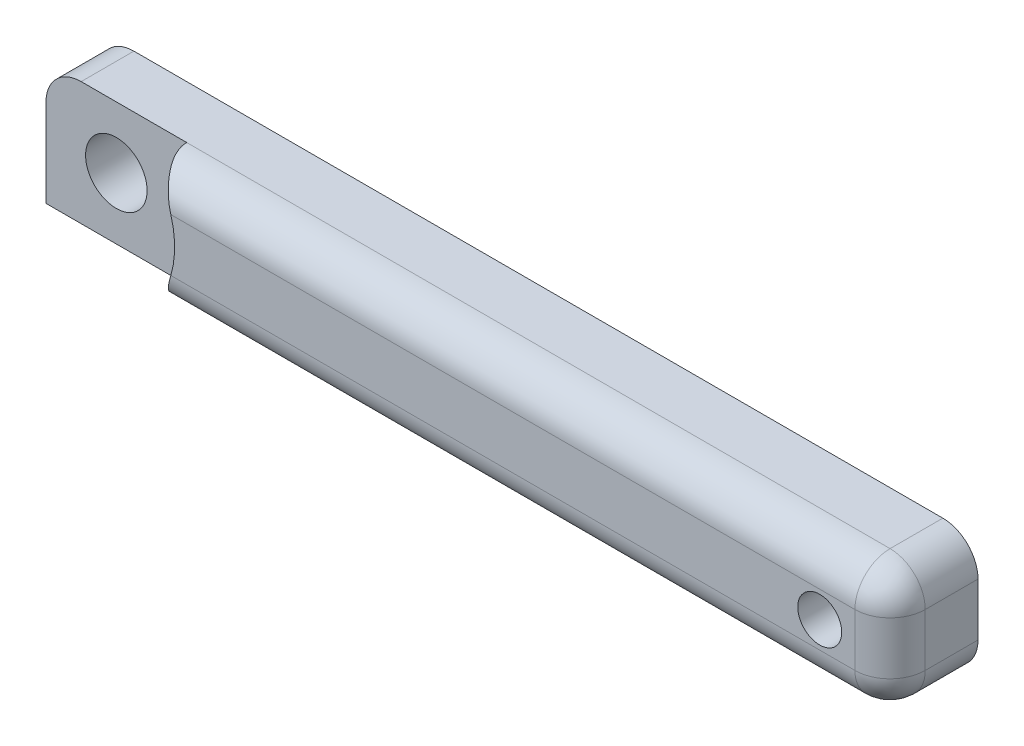
ISO-10303-21;
HEADER;
FILE_DESCRIPTION(('STEP AP214'),'2;1');
FILE_NAME('part.step','',(''),(''),'','','');
FILE_SCHEMA(('AUTOMOTIVE_DESIGN { 1 0 10303 214 1 1 1 1 }'));
ENDSEC;
DATA;
#1=APPLICATION_CONTEXT('core data for automotive mechanical design processes');
#2=APPLICATION_PROTOCOL_DEFINITION('international standard','automotive_design',2000,#1);
#3=PRODUCT_CONTEXT('',#1,'mechanical');
#4=PRODUCT('Part','Part','',(#3));
#5=PRODUCT_RELATED_PRODUCT_CATEGORY('part','',(#4));
#6=PRODUCT_DEFINITION_FORMATION('','',#4);
#7=PRODUCT_DEFINITION_CONTEXT('part definition',#1,'design');
#8=PRODUCT_DEFINITION('design','',#6,#7);
#9=PRODUCT_DEFINITION_SHAPE('','',#8);
#10=(LENGTH_UNIT() NAMED_UNIT(*) SI_UNIT(.MILLI.,.METRE.));
#11=(NAMED_UNIT(*) PLANE_ANGLE_UNIT() SI_UNIT($,.RADIAN.));
#12=(NAMED_UNIT(*) SI_UNIT($,.STERADIAN.) SOLID_ANGLE_UNIT());
#13=UNCERTAINTY_MEASURE_WITH_UNIT(LENGTH_MEASURE(1.E-05),#10,'distance_accuracy_value','');
#14=(GEOMETRIC_REPRESENTATION_CONTEXT(3) GLOBAL_UNCERTAINTY_ASSIGNED_CONTEXT((#13)) GLOBAL_UNIT_ASSIGNED_CONTEXT((#10,
#11,#12)) REPRESENTATION_CONTEXT('',''));
#15=CARTESIAN_POINT('',(0.,0.,0.));
#16=DIRECTION('',(0.,0.,1.));
#17=DIRECTION('',(1.,0.,0.));
#18=AXIS2_PLACEMENT_3D('',#15,#16,#17);
#19=CARTESIAN_POINT('',(4.,3.5,0.));
#20=DIRECTION('',(0.,0.,1.));
#21=DIRECTION('',(1.,0.,0.));
#22=AXIS2_PLACEMENT_3D('',#19,#20,#21);
#23=CYLINDRICAL_SURFACE('',#22,1.75);
#24=CARTESIAN_POINT('',(4.,3.5,0.));
#25=DIRECTION('',(0.,0.,1.));
#26=DIRECTION('',(1.,0.,0.));
#27=AXIS2_PLACEMENT_3D('',#24,#25,#26);
#28=CIRCLE('',#27,1.75);
#29=CARTESIAN_POINT('',(5.75,3.5,0.));
#30=VERTEX_POINT('',#29);
#31=EDGE_CURVE('E137',#30,#30,#28,.T.);
#32=ORIENTED_EDGE('',*,*,#31,.F.);
#33=EDGE_LOOP('',(#32));
#34=FACE_BOUND('',#33,.T.);
#35=CARTESIAN_POINT('',(4.,3.5,3.));
#36=DIRECTION('',(0.,0.,1.));
#37=DIRECTION('',(1.,0.,0.));
#38=AXIS2_PLACEMENT_3D('',#35,#36,#37);
#39=CIRCLE('',#38,1.75);
#40=CARTESIAN_POINT('',(5.75,3.5,3.));
#41=VERTEX_POINT('',#40);
#42=EDGE_CURVE('E179',#41,#41,#39,.F.);
#43=ORIENTED_EDGE('',*,*,#42,.F.);
#44=EDGE_LOOP('',(#43));
#45=FACE_BOUND('',#44,.T.);
#46=ADVANCED_FACE('F37',(#34,#45),#23,.F.);
#47=CARTESIAN_POINT('',(0.,4.99999999999999,5.));
#48=DIRECTION('',(1.,0.,0.));
#49=DIRECTION('',(0.,0.,-1.));
#50=AXIS2_PLACEMENT_3D('',#47,#48,#49);
#51=PLANE('',#50);
#52=DIRECTION('',(0.,0.,-1.));
#53=VECTOR('',#52,1.);
#54=CARTESIAN_POINT('',(0.,0.,5.));
#55=LINE('',#54,#53);
#56=CARTESIAN_POINT('',(0.,0.,3.));
#57=VERTEX_POINT('',#56);
#58=CARTESIAN_POINT('',(0.,0.,0.));
#59=VERTEX_POINT('',#58);
#60=EDGE_CURVE('E144',#57,#59,#55,.T.);
#61=ORIENTED_EDGE('',*,*,#60,.F.);
#62=DIRECTION('',(0.,-1.,0.));
#63=VECTOR('',#62,1.);
#64=CARTESIAN_POINT('',(0.,4.99999999999999,3.));
#65=LINE('',#64,#63);
#66=CARTESIAN_POINT('',(0.,5.,3.));
#67=VERTEX_POINT('',#66);
#68=EDGE_CURVE('E52',#57,#67,#65,.F.);
#69=ORIENTED_EDGE('',*,*,#68,.T.);
#70=DIRECTION('',(0.,0.,-1.));
#71=VECTOR('',#70,1.);
#72=CARTESIAN_POINT('',(0.,4.99999999999999,5.));
#73=LINE('',#72,#71);
#74=CARTESIAN_POINT('',(0.,4.99999999999999,0.));
#75=VERTEX_POINT('',#74);
#76=EDGE_CURVE('E283',#67,#75,#73,.T.);
#77=ORIENTED_EDGE('',*,*,#76,.T.);
#78=DIRECTION('',(0.,-1.,0.));
#79=VECTOR('',#78,1.);
#80=CARTESIAN_POINT('',(0.,4.99999999999999,0.));
#81=LINE('',#80,#79);
#82=EDGE_CURVE('E300',#75,#59,#81,.T.);
#83=ORIENTED_EDGE('',*,*,#82,.T.);
#84=EDGE_LOOP('',(#61,#69,#77,#83));
#85=FACE_BOUND('',#84,.T.);
#86=ADVANCED_FACE('F201',(#85),#51,.F.);
#87=CARTESIAN_POINT('',(0.,0.,5.));
#88=DIRECTION('',(0.,1.,0.));
#89=DIRECTION('',(0.,0.,1.));
#90=AXIS2_PLACEMENT_3D('',#87,#88,#89);
#91=PLANE('',#90);
#92=DIRECTION('',(0.,0.,-1.));
#93=VECTOR('',#92,1.);
#94=CARTESIAN_POINT('',(48.,0.,5.));
#95=LINE('',#94,#93);
#96=CARTESIAN_POINT('',(48.,0.,3.));
#97=VERTEX_POINT('',#96);
#98=CARTESIAN_POINT('',(48.,0.,0.));
#99=VERTEX_POINT('',#98);
#100=EDGE_CURVE('E148',#97,#99,#95,.T.);
#101=ORIENTED_EDGE('',*,*,#100,.F.);
#102=DIRECTION('',(1.,0.,0.));
#103=VECTOR('',#102,1.);
#104=CARTESIAN_POINT('',(0.,0.,3.));
#105=LINE('',#104,#103);
#106=CARTESIAN_POINT('',(8.,0.,3.));
#107=VERTEX_POINT('',#106);
#108=EDGE_CURVE('E153',#97,#107,#105,.F.);
#109=ORIENTED_EDGE('',*,*,#108,.T.);
#110=DIRECTION('',(-1.,0.,0.));
#111=VECTOR('',#110,1.);
#112=CARTESIAN_POINT('',(48.,0.,3.));
#113=LINE('',#112,#111);
#114=EDGE_CURVE('E138',#107,#57,#113,.T.);
#115=ORIENTED_EDGE('',*,*,#114,.T.);
#116=ORIENTED_EDGE('',*,*,#60,.T.);
#117=DIRECTION('',(1.,0.,0.));
#118=VECTOR('',#117,1.);
#119=CARTESIAN_POINT('',(0.,0.,0.));
#120=LINE('',#119,#118);
#121=EDGE_CURVE('E297',#59,#99,#120,.T.);
#122=ORIENTED_EDGE('',*,*,#121,.T.);
#123=EDGE_LOOP('',(#101,#109,#115,#116,#122));
#124=FACE_BOUND('',#123,.T.);
#125=ADVANCED_FACE('F238',(#124),#91,.F.);
#126=CARTESIAN_POINT('',(48.,2.,5.));
#127=DIRECTION('',(0.,0.,-1.));
#128=DIRECTION('',(-1.,0.,0.));
#129=AXIS2_PLACEMENT_3D('',#126,#127,#128);
#130=CYLINDRICAL_SURFACE('',#129,2.);
#131=DIRECTION('',(0.,0.,-1.));
#132=VECTOR('',#131,1.);
#133=CARTESIAN_POINT('',(50.,2.,5.));
#134=LINE('',#133,#132);
#135=CARTESIAN_POINT('',(50.,2.,3.));
#136=VERTEX_POINT('',#135);
#137=CARTESIAN_POINT('',(50.,2.,0.));
#138=VERTEX_POINT('',#137);
#139=EDGE_CURVE('E269',#136,#138,#134,.T.);
#140=ORIENTED_EDGE('',*,*,#139,.F.);
#141=CARTESIAN_POINT('',(48.,2.,3.));
#142=DIRECTION('',(0.,0.,-1.));
#143=DIRECTION('',(-1.,0.,0.));
#144=AXIS2_PLACEMENT_3D('',#141,#142,#143);
#145=CIRCLE('',#144,2.);
#146=EDGE_CURVE('E156',#136,#97,#145,.T.);
#147=ORIENTED_EDGE('',*,*,#146,.T.);
#148=ORIENTED_EDGE('',*,*,#100,.T.);
#149=CARTESIAN_POINT('',(48.,2.,0.));
#150=DIRECTION('',(0.,0.,1.));
#151=DIRECTION('',(1.,0.,0.));
#152=AXIS2_PLACEMENT_3D('',#149,#150,#151);
#153=CIRCLE('',#152,2.);
#154=EDGE_CURVE('E274',#99,#138,#153,.T.);
#155=ORIENTED_EDGE('',*,*,#154,.T.);
#156=EDGE_LOOP('',(#140,#147,#148,#155));
#157=FACE_BOUND('',#156,.T.);
#158=ADVANCED_FACE('F234',(#157),#130,.T.);
#159=CARTESIAN_POINT('',(50.,2.,5.));
#160=DIRECTION('',(-1.,0.,0.));
#161=DIRECTION('',(0.,0.,1.));
#162=AXIS2_PLACEMENT_3D('',#159,#160,#161);
#163=PLANE('',#162);
#164=DIRECTION('',(0.,0.,-1.));
#165=VECTOR('',#164,1.);
#166=CARTESIAN_POINT('',(50.,5.00000000000001,5.));
#167=LINE('',#166,#165);
#168=CARTESIAN_POINT('',(50.,5.00000000000001,3.));
#169=VERTEX_POINT('',#168);
#170=CARTESIAN_POINT('',(50.,5.00000000000001,0.));
#171=VERTEX_POINT('',#170);
#172=EDGE_CURVE('E271',#169,#171,#167,.T.);
#173=ORIENTED_EDGE('',*,*,#172,.F.);
#174=DIRECTION('',(0.,1.,0.));
#175=VECTOR('',#174,1.);
#176=CARTESIAN_POINT('',(50.,2.,3.));
#177=LINE('',#176,#175);
#178=EDGE_CURVE('E158',#169,#136,#177,.F.);
#179=ORIENTED_EDGE('',*,*,#178,.T.);
#180=ORIENTED_EDGE('',*,*,#139,.T.);
#181=DIRECTION('',(0.,1.,0.));
#182=VECTOR('',#181,1.);
#183=CARTESIAN_POINT('',(50.,2.,0.));
#184=LINE('',#183,#182);
#185=EDGE_CURVE('E294',#138,#171,#184,.T.);
#186=ORIENTED_EDGE('',*,*,#185,.T.);
#187=EDGE_LOOP('',(#173,#179,#180,#186));
#188=FACE_BOUND('',#187,.T.);
#189=ADVANCED_FACE('F231',(#188),#163,.F.);
#190=CARTESIAN_POINT('',(48.,5.00000000000001,5.));
#191=DIRECTION('',(0.,0.,-1.));
#192=DIRECTION('',(-1.,0.,0.));
#193=AXIS2_PLACEMENT_3D('',#190,#191,#192);
#194=CYLINDRICAL_SURFACE('',#193,2.);
#195=DIRECTION('',(0.,0.,-1.));
#196=VECTOR('',#195,1.);
#197=CARTESIAN_POINT('',(48.,7.00000000000001,5.));
#198=LINE('',#197,#196);
#199=CARTESIAN_POINT('',(48.,7.00000000000001,3.));
#200=VERTEX_POINT('',#199);
#201=CARTESIAN_POINT('',(48.,7.00000000000001,0.));
#202=VERTEX_POINT('',#201);
#203=EDGE_CURVE('E277',#200,#202,#198,.T.);
#204=ORIENTED_EDGE('',*,*,#203,.F.);
#205=CARTESIAN_POINT('',(48.,5.00000000000001,3.));
#206=DIRECTION('',(0.,0.,-1.));
#207=DIRECTION('',(-1.,0.,0.));
#208=AXIS2_PLACEMENT_3D('',#205,#206,#207);
#209=CIRCLE('',#208,2.);
#210=EDGE_CURVE('E66',#200,#169,#209,.T.);
#211=ORIENTED_EDGE('',*,*,#210,.T.);
#212=ORIENTED_EDGE('',*,*,#172,.T.);
#213=CARTESIAN_POINT('',(48.,5.00000000000001,0.));
#214=DIRECTION('',(0.,0.,1.));
#215=DIRECTION('',(1.,0.,0.));
#216=AXIS2_PLACEMENT_3D('',#213,#214,#215);
#217=CIRCLE('',#216,2.);
#218=EDGE_CURVE('E291',#171,#202,#217,.T.);
#219=ORIENTED_EDGE('',*,*,#218,.T.);
#220=EDGE_LOOP('',(#204,#211,#212,#219));
#221=FACE_BOUND('',#220,.T.);
#222=ADVANCED_FACE('F228',(#221),#194,.T.);
#223=CARTESIAN_POINT('',(48.,7.,5.));
#224=DIRECTION('',(0.,-1.,0.));
#225=DIRECTION('',(1.,0.,0.));
#226=AXIS2_PLACEMENT_3D('',#223,#224,#225);
#227=PLANE('',#226);
#228=DIRECTION('',(0.,0.,-1.));
#229=VECTOR('',#228,1.);
#230=CARTESIAN_POINT('',(2.00000000000001,7.,5.));
#231=LINE('',#230,#229);
#232=CARTESIAN_POINT('',(2.00000000000001,7.,3.));
#233=VERTEX_POINT('',#232);
#234=CARTESIAN_POINT('',(2.00000000000001,7.,0.));
#235=VERTEX_POINT('',#234);
#236=EDGE_CURVE('E281',#233,#235,#231,.T.);
#237=ORIENTED_EDGE('',*,*,#236,.F.);
#238=DIRECTION('',(-1.,0.,0.));
#239=VECTOR('',#238,1.);
#240=CARTESIAN_POINT('',(48.,7.,3.));
#241=LINE('',#240,#239);
#242=CARTESIAN_POINT('',(8.,7.,3.));
#243=VERTEX_POINT('',#242);
#244=EDGE_CURVE('E161',#233,#243,#241,.F.);
#245=ORIENTED_EDGE('',*,*,#244,.T.);
#246=EDGE_CURVE('E59',#243,#200,#241,.F.);
#247=ORIENTED_EDGE('',*,*,#246,.T.);
#248=ORIENTED_EDGE('',*,*,#203,.T.);
#249=DIRECTION('',(-1.,0.,0.));
#250=VECTOR('',#249,1.);
#251=CARTESIAN_POINT('',(48.,7.,0.));
#252=LINE('',#251,#250);
#253=EDGE_CURVE('E288',#202,#235,#252,.T.);
#254=ORIENTED_EDGE('',*,*,#253,.T.);
#255=EDGE_LOOP('',(#237,#245,#247,#248,#254));
#256=FACE_BOUND('',#255,.T.);
#257=ADVANCED_FACE('F224',(#256),#227,.F.);
#258=CARTESIAN_POINT('',(2.,5.,5.));
#259=DIRECTION('',(0.,0.,-1.));
#260=DIRECTION('',(-1.,0.,0.));
#261=AXIS2_PLACEMENT_3D('',#258,#259,#260);
#262=CYLINDRICAL_SURFACE('',#261,2.);
#263=ORIENTED_EDGE('',*,*,#76,.F.);
#264=CARTESIAN_POINT('',(2.,5.,3.));
#265=DIRECTION('',(0.,0.,-1.));
#266=DIRECTION('',(-1.,0.,0.));
#267=AXIS2_PLACEMENT_3D('',#264,#265,#266);
#268=CIRCLE('',#267,2.);
#269=EDGE_CURVE('E163',#67,#233,#268,.T.);
#270=ORIENTED_EDGE('',*,*,#269,.T.);
#271=ORIENTED_EDGE('',*,*,#236,.T.);
#272=CARTESIAN_POINT('',(2.,5.,0.));
#273=DIRECTION('',(0.,0.,1.));
#274=DIRECTION('',(1.,0.,0.));
#275=AXIS2_PLACEMENT_3D('',#272,#273,#274);
#276=CIRCLE('',#275,2.);
#277=EDGE_CURVE('E285',#235,#75,#276,.T.);
#278=ORIENTED_EDGE('',*,*,#277,.T.);
#279=EDGE_LOOP('',(#263,#270,#271,#278));
#280=FACE_BOUND('',#279,.T.);
#281=ADVANCED_FACE('F218',(#280),#262,.T.);
#282=CARTESIAN_POINT('',(48.,2.,5.));
#283=DIRECTION('',(0.,0.,1.));
#284=DIRECTION('',(1.,0.,0.));
#285=AXIS2_PLACEMENT_3D('',#282,#283,#284);
#286=PLANE('',#285);
#287=CARTESIAN_POINT('',(4.,3.5,5.));
#288=DIRECTION('',(0.,0.,1.));
#289=DIRECTION('',(1.,0.,0.));
#290=AXIS2_PLACEMENT_3D('',#287,#288,#289);
#291=CIRCLE('',#290,5.31507290636733);
#292=CARTESIAN_POINT('',(9.09901951359279,2.,5.));
#293=VERTEX_POINT('',#292);
#294=CARTESIAN_POINT('',(9.09901951359279,5.,5.));
#295=VERTEX_POINT('',#294);
#296=EDGE_CURVE('E120',#293,#295,#291,.T.);
#297=ORIENTED_EDGE('',*,*,#296,.F.);
#298=DIRECTION('',(1.,0.,0.));
#299=VECTOR('',#298,1.);
#300=CARTESIAN_POINT('',(48.,2.,5.));
#301=LINE('',#300,#299);
#302=CARTESIAN_POINT('',(48.,2.,5.));
#303=VERTEX_POINT('',#302);
#304=EDGE_CURVE('E146',#293,#303,#301,.T.);
#305=ORIENTED_EDGE('',*,*,#304,.T.);
#306=DIRECTION('',(0.,1.,0.));
#307=VECTOR('',#306,1.);
#308=CARTESIAN_POINT('',(48.,5.00000000000001,5.));
#309=LINE('',#308,#307);
#310=CARTESIAN_POINT('',(48.,5.,5.));
#311=VERTEX_POINT('',#310);
#312=EDGE_CURVE('E143',#303,#311,#309,.T.);
#313=ORIENTED_EDGE('',*,*,#312,.T.);
#314=DIRECTION('',(-1.,0.,0.));
#315=VECTOR('',#314,1.);
#316=CARTESIAN_POINT('',(2.00000000000002,5.,5.));
#317=LINE('',#316,#315);
#318=EDGE_CURVE('E135',#311,#295,#317,.T.);
#319=ORIENTED_EDGE('',*,*,#318,.T.);
#320=EDGE_LOOP('',(#297,#305,#313,#319));
#321=FACE_BOUND('',#320,.T.);
#322=CARTESIAN_POINT('',(46.,3.5,5.));
#323=DIRECTION('',(0.,0.,-1.));
#324=DIRECTION('',(-1.,0.,0.));
#325=AXIS2_PLACEMENT_3D('',#322,#323,#324);
#326=CIRCLE('',#325,1.25);
#327=CARTESIAN_POINT('',(44.75,3.5,5.));
#328=VERTEX_POINT('',#327);
#329=EDGE_CURVE('E307',#328,#328,#326,.T.);
#330=ORIENTED_EDGE('',*,*,#329,.T.);
#331=EDGE_LOOP('',(#330));
#332=FACE_BOUND('',#331,.T.);
#333=ADVANCED_FACE('F140',(#321,#332),#286,.T.);
#334=CARTESIAN_POINT('',(48.,2.,0.));
#335=DIRECTION('',(0.,0.,1.));
#336=DIRECTION('',(1.,0.,0.));
#337=AXIS2_PLACEMENT_3D('',#334,#335,#336);
#338=PLANE('',#337);
#339=ORIENTED_EDGE('',*,*,#31,.T.);
#340=EDGE_LOOP('',(#339));
#341=FACE_BOUND('',#340,.T.);
#342=CARTESIAN_POINT('',(46.,3.5,0.));
#343=DIRECTION('',(0.,0.,-1.));
#344=DIRECTION('',(-1.,0.,0.));
#345=AXIS2_PLACEMENT_3D('',#342,#343,#344);
#346=CIRCLE('',#345,2.4);
#347=CARTESIAN_POINT('',(43.6,3.5,0.));
#348=VERTEX_POINT('',#347);
#349=EDGE_CURVE('E304',#348,#348,#346,.T.);
#350=ORIENTED_EDGE('',*,*,#349,.F.);
#351=EDGE_LOOP('',(#350));
#352=FACE_BOUND('',#351,.T.);
#353=ORIENTED_EDGE('',*,*,#82,.F.);
#354=ORIENTED_EDGE('',*,*,#277,.F.);
#355=ORIENTED_EDGE('',*,*,#253,.F.);
#356=ORIENTED_EDGE('',*,*,#218,.F.);
#357=ORIENTED_EDGE('',*,*,#185,.F.);
#358=ORIENTED_EDGE('',*,*,#154,.F.);
#359=ORIENTED_EDGE('',*,*,#121,.F.);
#360=EDGE_LOOP('',(#353,#354,#355,#356,#357,#358,#359));
#361=FACE_BOUND('',#360,.T.);
#362=ADVANCED_FACE('F214',(#341,#352,#361),#338,.F.);
#363=CARTESIAN_POINT('',(46.,3.5,3.));
#364=DIRECTION('',(0.,0.,-1.));
#365=DIRECTION('',(-1.,0.,0.));
#366=AXIS2_PLACEMENT_3D('',#363,#364,#365);
#367=CYLINDRICAL_SURFACE('',#366,2.4);
#368=CARTESIAN_POINT('',(46.,3.5,3.));
#369=DIRECTION('',(0.,0.,-1.));
#370=DIRECTION('',(-1.,0.,0.));
#371=AXIS2_PLACEMENT_3D('',#368,#369,#370);
#372=CIRCLE('',#371,2.4);
#373=CARTESIAN_POINT('',(43.6,3.5,3.));
#374=VERTEX_POINT('',#373);
#375=EDGE_CURVE('E303',#374,#374,#372,.T.);
#376=ORIENTED_EDGE('',*,*,#375,.F.);
#377=EDGE_LOOP('',(#376));
#378=FACE_BOUND('',#377,.T.);
#379=ORIENTED_EDGE('',*,*,#349,.T.);
#380=EDGE_LOOP('',(#379));
#381=FACE_BOUND('',#380,.T.);
#382=ADVANCED_FACE('F210',(#378,#381),#367,.F.);
#383=CARTESIAN_POINT('',(46.,3.5,3.));
#384=DIRECTION('',(0.,0.,-1.));
#385=DIRECTION('',(-1.,0.,0.));
#386=AXIS2_PLACEMENT_3D('',#383,#384,#385);
#387=PLANE('',#386);
#388=CARTESIAN_POINT('',(46.,3.5,3.));
#389=DIRECTION('',(0.,0.,-1.));
#390=DIRECTION('',(-1.,0.,0.));
#391=AXIS2_PLACEMENT_3D('',#388,#389,#390);
#392=CIRCLE('',#391,1.25);
#393=CARTESIAN_POINT('',(44.75,3.5,3.));
#394=VERTEX_POINT('',#393);
#395=EDGE_CURVE('E178',#394,#394,#392,.T.);
#396=ORIENTED_EDGE('',*,*,#395,.F.);
#397=EDGE_LOOP('',(#396));
#398=FACE_BOUND('',#397,.T.);
#399=ORIENTED_EDGE('',*,*,#375,.T.);
#400=EDGE_LOOP('',(#399));
#401=FACE_BOUND('',#400,.T.);
#402=ADVANCED_FACE('F206',(#398,#401),#387,.T.);
#403=CARTESIAN_POINT('',(46.,3.5,5.));
#404=DIRECTION('',(0.,0.,-1.));
#405=DIRECTION('',(-1.,0.,0.));
#406=AXIS2_PLACEMENT_3D('',#403,#404,#405);
#407=CYLINDRICAL_SURFACE('',#406,1.25);
#408=ORIENTED_EDGE('',*,*,#329,.F.);
#409=EDGE_LOOP('',(#408));
#410=FACE_BOUND('',#409,.T.);
#411=ORIENTED_EDGE('',*,*,#395,.T.);
#412=EDGE_LOOP('',(#411));
#413=FACE_BOUND('',#412,.T.);
#414=ADVANCED_FACE('F203',(#410,#413),#407,.F.);
#415=CARTESIAN_POINT('',(48.,5.,3.));
#416=DIRECTION('',(1.,0.,0.));
#417=DIRECTION('',(0.,1.,0.));
#418=AXIS2_PLACEMENT_3D('',#415,#416,#417);
#419=CYLINDRICAL_SURFACE('',#418,2.);
#420=CARTESIAN_POINT('',(9.09901951359279,5.,5.));
#421=CARTESIAN_POINT('',(9.08159318350321,5.0592734044936,5.00000578114525));
#422=CARTESIAN_POINT('',(9.06312008201389,5.11821861960465,4.99736553729506));
#423=CARTESIAN_POINT('',(9.02429735674916,5.2349902106107,4.98700938669746));
#424=CARTESIAN_POINT('',(9.00394911215821,5.29281737156367,4.9792971852003));
#425=CARTESIAN_POINT('',(8.96167620265793,5.40668423233383,4.95906511124045));
#426=CARTESIAN_POINT('',(8.9397601937615,5.46273160236137,4.94657019670598));
#427=CARTESIAN_POINT('',(8.89450608851909,5.57300955525186,4.91700848834096));
#428=CARTESIAN_POINT('',(8.87116774702497,5.62723982241498,4.89994090465022));
#429=CARTESIAN_POINT('',(8.79954081221432,5.78645561973104,4.84233260612003));
#430=CARTESIAN_POINT('',(8.74948466935997,5.88837992679354,4.79531025802551));
#431=CARTESIAN_POINT('',(8.64694082740296,6.08225263777683,4.6855815021965));
#432=CARTESIAN_POINT('',(8.59444824109186,6.17417963490902,4.62284235353747));
#433=CARTESIAN_POINT('',(8.48474427841581,6.35468553613693,4.47634330902465));
#434=CARTESIAN_POINT('',(8.42755570757036,6.44212727665811,4.39115730060864));
#435=CARTESIAN_POINT('',(8.31762586270133,6.60119956565943,4.20463964186724));
#436=CARTESIAN_POINT('',(8.2648805997279,6.67284439123713,4.10332271434011));
#437=CARTESIAN_POINT('',(8.1812371141661,6.78188036334141,3.91307823092504));
#438=CARTESIAN_POINT('',(8.14818035892875,6.8233547120337,3.82744114141133));
#439=CARTESIAN_POINT('',(8.09038910778473,6.89423213827734,3.64888818361824));
#440=CARTESIAN_POINT('',(8.0656270383851,6.9236752836305,3.55599772323231));
#441=CARTESIAN_POINT('',(8.03141471407803,6.96384647636263,3.38615971601597));
#442=CARTESIAN_POINT('',(8.01977702704072,6.97728942834358,3.3103021160392));
#443=CARTESIAN_POINT('',(8.00798721882039,6.99085541884224,3.19496186381662));
#444=CARTESIAN_POINT('',(8.005001361963,6.99427793538308,3.15612706326435));
#445=CARTESIAN_POINT('',(8.00100427187571,6.99885253640543,3.07819971429774));
#446=CARTESIAN_POINT('',(7.99999423613728,7.00000324400923,3.0391070239739));
#447=CARTESIAN_POINT('',(8.,7.,3.));
#448=B_SPLINE_CURVE_WITH_KNOTS('',3,(#420,#421,#422,#423,#424,#425,#426,#427,#428,#429,#430,
#431,#432,#433,#434,#435,#436,#437,#438,#439,#440,#441,#442,#443,#444,#445,#446,#447),
.UNSPECIFIED.,.F.,.F.,(4,2,2,2,2,2,2,2,2,2,2,2,2,4),(0.,0.185250587137083,0.370365992063371,
0.55452828462593,0.738722409002162,1.10578085396475,1.47361040058087,1.87619695865032,
2.27841815774215,2.57950294210439,2.87957668006167,3.11243053741781,3.22962354094819,
3.34688754999264),.UNSPECIFIED.);
#449=EDGE_CURVE('E124',#295,#243,#448,.T.);
#450=ORIENTED_EDGE('',*,*,#449,.F.);
#451=ORIENTED_EDGE('',*,*,#318,.F.);
#452=CARTESIAN_POINT('',(48.,5.,3.));
#453=DIRECTION('',(1.,0.,0.));
#454=DIRECTION('',(0.,0.,-1.));
#455=AXIS2_PLACEMENT_3D('',#452,#453,#454);
#456=CIRCLE('',#455,2.);
#457=EDGE_CURVE('E177',#200,#311,#456,.T.);
#458=ORIENTED_EDGE('',*,*,#457,.F.);
#459=ORIENTED_EDGE('',*,*,#246,.F.);
#460=EDGE_LOOP('',(#450,#451,#458,#459));
#461=FACE_BOUND('',#460,.T.);
#462=ADVANCED_FACE('F39',(#461),#419,.T.);
#463=CARTESIAN_POINT('',(48.,5.00000000000001,3.));
#464=DIRECTION('',(0.,0.,1.));
#465=DIRECTION('',(1.,0.,0.));
#466=AXIS2_PLACEMENT_3D('',#463,#464,#465);
#467=SPHERICAL_SURFACE('',#466,2.);
#468=ORIENTED_EDGE('',*,*,#210,.F.);
#469=ORIENTED_EDGE('',*,*,#457,.T.);
#470=CARTESIAN_POINT('',(48.,5.00000000000001,3.));
#471=DIRECTION('',(0.,-1.,0.));
#472=DIRECTION('',(0.,0.,-1.));
#473=AXIS2_PLACEMENT_3D('',#470,#471,#472);
#474=CIRCLE('',#473,2.);
#475=EDGE_CURVE('E174',#169,#311,#474,.T.);
#476=ORIENTED_EDGE('',*,*,#475,.F.);
#477=EDGE_LOOP('',(#468,#469,#476));
#478=FACE_BOUND('',#477,.T.);
#479=ADVANCED_FACE('F256',(#478),#467,.T.);
#480=CARTESIAN_POINT('',(48.,2.,3.));
#481=DIRECTION('',(0.,-1.,0.));
#482=DIRECTION('',(0.,0.,-1.));
#483=AXIS2_PLACEMENT_3D('',#480,#481,#482);
#484=CYLINDRICAL_SURFACE('',#483,2.);
#485=ORIENTED_EDGE('',*,*,#475,.T.);
#486=ORIENTED_EDGE('',*,*,#312,.F.);
#487=CARTESIAN_POINT('',(48.,2.,3.));
#488=DIRECTION('',(0.,-1.,0.));
#489=DIRECTION('',(0.,0.,-1.));
#490=AXIS2_PLACEMENT_3D('',#487,#488,#489);
#491=CIRCLE('',#490,2.);
#492=EDGE_CURVE('E171',#136,#303,#491,.T.);
#493=ORIENTED_EDGE('',*,*,#492,.F.);
#494=ORIENTED_EDGE('',*,*,#178,.F.);
#495=EDGE_LOOP('',(#485,#486,#493,#494));
#496=FACE_BOUND('',#495,.T.);
#497=ADVANCED_FACE('F253',(#496),#484,.T.);
#498=CARTESIAN_POINT('',(48.,2.,3.));
#499=DIRECTION('',(0.,0.,1.));
#500=DIRECTION('',(1.,0.,0.));
#501=AXIS2_PLACEMENT_3D('',#498,#499,#500);
#502=SPHERICAL_SURFACE('',#501,2.);
#503=ORIENTED_EDGE('',*,*,#146,.F.);
#504=ORIENTED_EDGE('',*,*,#492,.T.);
#505=CARTESIAN_POINT('',(48.,2.,3.));
#506=DIRECTION('',(-1.,0.,0.));
#507=DIRECTION('',(0.,0.,1.));
#508=AXIS2_PLACEMENT_3D('',#505,#506,#507);
#509=CIRCLE('',#508,2.);
#510=EDGE_CURVE('E168',#97,#303,#509,.T.);
#511=ORIENTED_EDGE('',*,*,#510,.F.);
#512=EDGE_LOOP('',(#503,#504,#511));
#513=FACE_BOUND('',#512,.T.);
#514=ADVANCED_FACE('F249',(#513),#502,.T.);
#515=CARTESIAN_POINT('',(48.,2.,3.));
#516=DIRECTION('',(-1.,0.,0.));
#517=DIRECTION('',(0.,0.,1.));
#518=AXIS2_PLACEMENT_3D('',#515,#516,#517);
#519=CYLINDRICAL_SURFACE('',#518,2.);
#520=CARTESIAN_POINT('',(8.,0.,3.));
#521=CARTESIAN_POINT('',(7.99998156688136,-1.1837369899184E-05,3.04822858572251));
#522=CARTESIAN_POINT('',(8.00152588368038,0.00174402513732102,3.09644511113957));
#523=CARTESIAN_POINT('',(8.00759890262558,0.00869804011388261,3.1923931013993));
#524=CARTESIAN_POINT('',(8.0121246140166,0.0138927429715888,3.24012500371361));
#525=CARTESIAN_POINT('',(8.02396755757651,0.0275712970169365,3.33432531946163));
#526=CARTESIAN_POINT('',(8.03125990769245,0.0360258412194155,3.38080115024769));
#527=CARTESIAN_POINT('',(8.04839569935064,0.0560681606107687,3.47258663417047));
#528=CARTESIAN_POINT('',(8.05823964981999,0.0676565608800043,3.51789605267735));
#529=CARTESIAN_POINT('',(8.0910971328239,0.106759327358303,3.65129731176729));
#530=CARTESIAN_POINT('',(8.11749706108633,0.138678794843045,3.73731049846144));
#531=CARTESIAN_POINT('',(8.17694448128634,0.212844727731169,3.90239055881216));
#532=CARTESIAN_POINT('',(8.21000733190442,0.25511510231245,3.98144076576052));
#533=CARTESIAN_POINT('',(8.28492590601178,0.354567118710262,4.14126207770316));
#534=CARTESIAN_POINT('',(8.32736427886439,0.412953426634294,4.22100799642108));
#535=CARTESIAN_POINT('',(8.41511980521759,0.539818113183902,4.37020768760757));
#536=CARTESIAN_POINT('',(8.46043853093605,0.608302030898391,4.43965576894607));
#537=CARTESIAN_POINT('',(8.56170116214031,0.770191046557423,4.58162641929626));
#538=CARTESIAN_POINT('',(8.61781833243661,0.865780056982018,4.65155074504438));
#539=CARTESIAN_POINT('',(8.72780380284452,1.06871434512092,4.77389618577527));
#540=CARTESIAN_POINT('',(8.78167388701959,1.17605004142257,4.826331426817));
#541=CARTESIAN_POINT('',(8.85834188463316,1.34355571873067,4.89013246515949));
#542=CARTESIAN_POINT('',(8.88307671628448,1.40012831405455,4.90885771209615));
#543=CARTESIAN_POINT('',(8.93101955922691,1.51532589752801,4.94130597718675));
#544=CARTESIAN_POINT('',(8.95422787215879,1.57395047667559,4.95502998603579));
#545=CARTESIAN_POINT('',(8.99892337703333,1.69311767077247,4.97724809995978));
#546=CARTESIAN_POINT('',(9.02040297288992,1.75366727603689,4.98572011458428));
#547=CARTESIAN_POINT('',(9.06131366520713,1.87602269543902,4.99710181218284));
#548=CARTESIAN_POINT('',(9.08074303279628,1.93782951817751,5.00000683561127));
#549=CARTESIAN_POINT('',(9.09901951359279,2.,5.));
#550=B_SPLINE_CURVE_WITH_KNOTS('',3,(#520,#521,#522,#523,#524,#525,#526,#527,#528,#529,#530,
#531,#532,#533,#534,#535,#536,#537,#538,#539,#540,#541,#542,#543,#544,#545,#546,#547,#548,#549),
.UNSPECIFIED.,.F.,.F.,(4,2,2,2,2,2,2,2,2,2,2,2,2,2,4),(0.,0.144609572838311,0.289074302524227,
0.432269443335392,0.575493167007826,0.860586129895392,1.14634393528559,1.46790276128082,
1.78963864061837,2.18113372179491,2.57231181947719,2.7656720259126,2.95899390878309,
3.15312350315843,3.34741551224934),.UNSPECIFIED.);
#551=EDGE_CURVE('E11',#107,#293,#550,.T.);
#552=ORIENTED_EDGE('',*,*,#551,.F.);
#553=ORIENTED_EDGE('',*,*,#108,.F.);
#554=ORIENTED_EDGE('',*,*,#510,.T.);
#555=ORIENTED_EDGE('',*,*,#304,.F.);
#556=EDGE_LOOP('',(#552,#553,#554,#555));
#557=FACE_BOUND('',#556,.T.);
#558=ADVANCED_FACE('F245',(#557),#519,.T.);
#559=CARTESIAN_POINT('',(4.,3.5,3.));
#560=DIRECTION('',(0.,0.,1.));
#561=DIRECTION('',(1.,0.,0.));
#562=AXIS2_PLACEMENT_3D('',#559,#560,#561);
#563=PLANE('',#562);
#564=ORIENTED_EDGE('',*,*,#269,.F.);
#565=ORIENTED_EDGE('',*,*,#68,.F.);
#566=ORIENTED_EDGE('',*,*,#114,.F.);
#567=CARTESIAN_POINT('',(4.,3.5,3.));
#568=DIRECTION('',(0.,0.,1.));
#569=DIRECTION('',(1.,0.,0.));
#570=AXIS2_PLACEMENT_3D('',#567,#568,#569);
#571=CIRCLE('',#570,5.31507290636733);
#572=EDGE_CURVE('E130',#107,#243,#571,.T.);
#573=ORIENTED_EDGE('',*,*,#572,.T.);
#574=ORIENTED_EDGE('',*,*,#244,.F.);
#575=EDGE_LOOP('',(#564,#565,#566,#573,#574));
#576=FACE_BOUND('',#575,.T.);
#577=ORIENTED_EDGE('',*,*,#42,.T.);
#578=EDGE_LOOP('',(#577));
#579=FACE_BOUND('',#578,.T.);
#580=ADVANCED_FACE('F197',(#576,#579),#563,.T.);
#581=CARTESIAN_POINT('',(4.,3.5,3.));
#582=DIRECTION('',(0.,0.,1.));
#583=DIRECTION('',(1.,0.,0.));
#584=AXIS2_PLACEMENT_3D('',#581,#582,#583);
#585=CYLINDRICAL_SURFACE('',#584,5.31507290636733);
#586=ORIENTED_EDGE('',*,*,#449,.T.);
#587=ORIENTED_EDGE('',*,*,#572,.F.);
#588=ORIENTED_EDGE('',*,*,#551,.T.);
#589=ORIENTED_EDGE('',*,*,#296,.T.);
#590=EDGE_LOOP('',(#586,#587,#588,#589));
#591=FACE_BOUND('',#590,.T.);
#592=ADVANCED_FACE('F122',(#591),#585,.F.);
#593=CLOSED_SHELL('',(#46,#86,#125,#158,#189,#222,#257,#281,#333,#362,#382,#402,#414,#462,#479,
#497,#514,#558,#580,#592));
#594=MANIFOLD_SOLID_BREP('B2',#593);
#595=ADVANCED_BREP_SHAPE_REPRESENTATION('',(#18,#594),#14);
#596=SHAPE_DEFINITION_REPRESENTATION(#9,#595);
ENDSEC;
END-ISO-10303-21;
